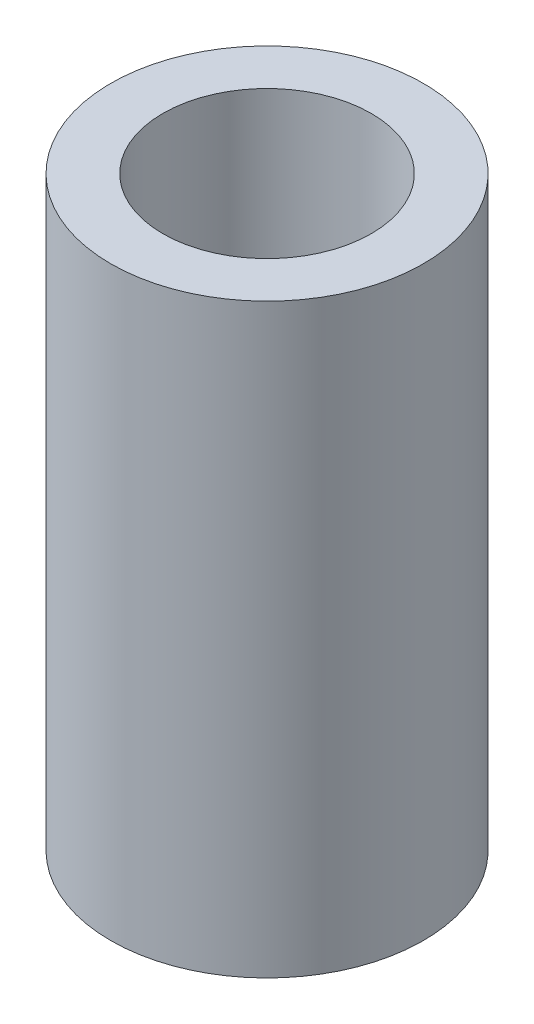
ISO-10303-21;
HEADER;
FILE_DESCRIPTION(('STEP AP214'),'2;1');
FILE_NAME('part.step','',(''),(''),'','','');
FILE_SCHEMA(('AUTOMOTIVE_DESIGN { 1 0 10303 214 1 1 1 1 }'));
ENDSEC;
DATA;
#1=APPLICATION_CONTEXT('core data for automotive mechanical design processes');
#2=APPLICATION_PROTOCOL_DEFINITION('international standard','automotive_design',2000,#1);
#3=PRODUCT_CONTEXT('',#1,'mechanical');
#4=PRODUCT('Part','Part','',(#3));
#5=PRODUCT_RELATED_PRODUCT_CATEGORY('part','',(#4));
#6=PRODUCT_DEFINITION_FORMATION('','',#4);
#7=PRODUCT_DEFINITION_CONTEXT('part definition',#1,'design');
#8=PRODUCT_DEFINITION('design','',#6,#7);
#9=PRODUCT_DEFINITION_SHAPE('','',#8);
#10=(LENGTH_UNIT() NAMED_UNIT(*) SI_UNIT(.MILLI.,.METRE.));
#11=(NAMED_UNIT(*) PLANE_ANGLE_UNIT() SI_UNIT($,.RADIAN.));
#12=(NAMED_UNIT(*) SI_UNIT($,.STERADIAN.) SOLID_ANGLE_UNIT());
#13=UNCERTAINTY_MEASURE_WITH_UNIT(LENGTH_MEASURE(1.E-05),#10,'distance_accuracy_value','');
#14=(GEOMETRIC_REPRESENTATION_CONTEXT(3) GLOBAL_UNCERTAINTY_ASSIGNED_CONTEXT((#13)) GLOBAL_UNIT_ASSIGNED_CONTEXT((#10,
#11,#12)) REPRESENTATION_CONTEXT('',''));
#15=CARTESIAN_POINT('',(0.,0.,0.));
#16=DIRECTION('',(0.,0.,1.));
#17=DIRECTION('',(1.,0.,0.));
#18=AXIS2_PLACEMENT_3D('',#15,#16,#17);
#19=CARTESIAN_POINT('',(0.,9.,0.));
#20=DIRECTION('',(0.,1.,0.));
#21=DIRECTION('',(0.,0.,1.));
#22=AXIS2_PLACEMENT_3D('',#19,#20,#21);
#23=PLANE('',#22);
#24=CARTESIAN_POINT('',(0.,9.,0.));
#25=DIRECTION('',(0.,1.,0.));
#26=DIRECTION('',(0.,0.,1.));
#27=AXIS2_PLACEMENT_3D('',#24,#25,#26);
#28=CIRCLE('',#27,2.4);
#29=CARTESIAN_POINT('',(0.,9.,2.4));
#30=VERTEX_POINT('',#29);
#31=EDGE_CURVE('E10',#30,#30,#28,.T.);
#32=ORIENTED_EDGE('',*,*,#31,.T.);
#33=EDGE_LOOP('',(#32));
#34=FACE_BOUND('',#33,.T.);
#35=CARTESIAN_POINT('',(0.,9.,0.));
#36=DIRECTION('',(0.,1.,0.));
#37=DIRECTION('',(0.,0.,1.));
#38=AXIS2_PLACEMENT_3D('',#35,#36,#37);
#39=CIRCLE('',#38,1.6);
#40=CARTESIAN_POINT('',(0.,9.,1.6));
#41=VERTEX_POINT('',#40);
#42=EDGE_CURVE('E56',#41,#41,#39,.T.);
#43=ORIENTED_EDGE('',*,*,#42,.F.);
#44=EDGE_LOOP('',(#43));
#45=FACE_BOUND('',#44,.T.);
#46=ADVANCED_FACE('F43',(#34,#45),#23,.T.);
#47=CARTESIAN_POINT('',(0.,0.,0.));
#48=DIRECTION('',(0.,1.,0.));
#49=DIRECTION('',(0.,0.,1.));
#50=AXIS2_PLACEMENT_3D('',#47,#48,#49);
#51=PLANE('',#50);
#52=CARTESIAN_POINT('',(0.,0.,0.));
#53=DIRECTION('',(0.,1.,0.));
#54=DIRECTION('',(0.,0.,1.));
#55=AXIS2_PLACEMENT_3D('',#52,#53,#54);
#56=CIRCLE('',#55,2.4);
#57=CARTESIAN_POINT('',(0.,0.,2.4));
#58=VERTEX_POINT('',#57);
#59=EDGE_CURVE('E47',#58,#58,#56,.T.);
#60=ORIENTED_EDGE('',*,*,#59,.F.);
#61=EDGE_LOOP('',(#60));
#62=FACE_BOUND('',#61,.T.);
#63=CARTESIAN_POINT('',(0.,0.,0.));
#64=DIRECTION('',(0.,1.,0.));
#65=DIRECTION('',(0.,0.,1.));
#66=AXIS2_PLACEMENT_3D('',#63,#64,#65);
#67=CIRCLE('',#66,1.6);
#68=CARTESIAN_POINT('',(0.,0.,1.6));
#69=VERTEX_POINT('',#68);
#70=EDGE_CURVE('E58',#69,#69,#67,.T.);
#71=ORIENTED_EDGE('',*,*,#70,.T.);
#72=EDGE_LOOP('',(#71));
#73=FACE_BOUND('',#72,.T.);
#74=ADVANCED_FACE('F70',(#62,#73),#51,.F.);
#75=CARTESIAN_POINT('',(0.,9.,0.));
#76=DIRECTION('',(0.,-1.,0.));
#77=DIRECTION('',(0.,0.,-1.));
#78=AXIS2_PLACEMENT_3D('',#75,#76,#77);
#79=CYLINDRICAL_SURFACE('',#78,2.4);
#80=ORIENTED_EDGE('',*,*,#31,.F.);
#81=EDGE_LOOP('',(#80));
#82=FACE_BOUND('',#81,.T.);
#83=ORIENTED_EDGE('',*,*,#59,.T.);
#84=EDGE_LOOP('',(#83));
#85=FACE_BOUND('',#84,.T.);
#86=ADVANCED_FACE('F45',(#82,#85),#79,.T.);
#87=CARTESIAN_POINT('',(0.,9.,0.));
#88=DIRECTION('',(0.,-1.,0.));
#89=DIRECTION('',(0.,0.,-1.));
#90=AXIS2_PLACEMENT_3D('',#87,#88,#89);
#91=CYLINDRICAL_SURFACE('',#90,1.6);
#92=ORIENTED_EDGE('',*,*,#42,.T.);
#93=EDGE_LOOP('',(#92));
#94=FACE_BOUND('',#93,.T.);
#95=ORIENTED_EDGE('',*,*,#70,.F.);
#96=EDGE_LOOP('',(#95));
#97=FACE_BOUND('',#96,.T.);
#98=ADVANCED_FACE('F66',(#94,#97),#91,.F.);
#99=CLOSED_SHELL('',(#46,#74,#86,#98));
#100=MANIFOLD_SOLID_BREP('B2',#99);
#101=ADVANCED_BREP_SHAPE_REPRESENTATION('',(#18,#100),#14);
#102=SHAPE_DEFINITION_REPRESENTATION(#9,#101);
ENDSEC;
END-ISO-10303-21;
